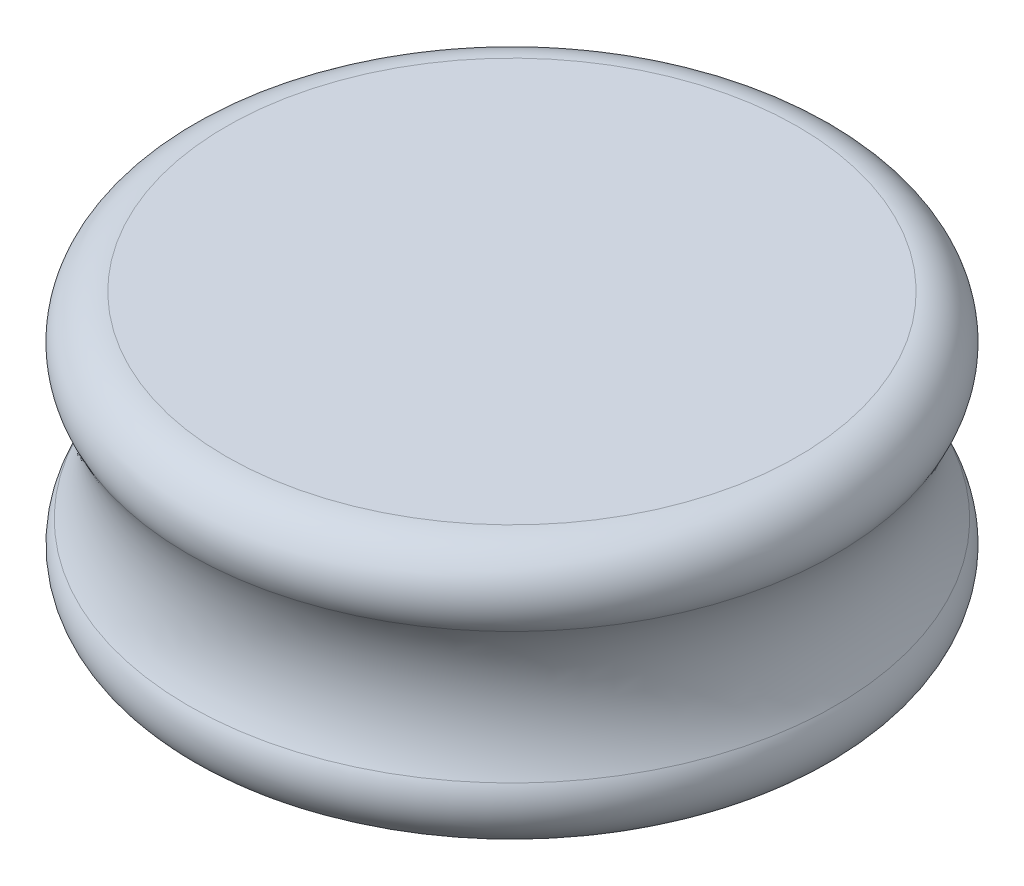
ISO-10303-21;
HEADER;
FILE_DESCRIPTION(('STEP AP214'),'2;1');
FILE_NAME('part.step','',(''),(''),'','','');
FILE_SCHEMA(('AUTOMOTIVE_DESIGN { 1 0 10303 214 1 1 1 1 }'));
ENDSEC;
DATA;
#1=APPLICATION_CONTEXT('core data for automotive mechanical design processes');
#2=APPLICATION_PROTOCOL_DEFINITION('international standard','automotive_design',2000,#1);
#3=PRODUCT_CONTEXT('',#1,'mechanical');
#4=PRODUCT('Part','Part','',(#3));
#5=PRODUCT_RELATED_PRODUCT_CATEGORY('part','',(#4));
#6=PRODUCT_DEFINITION_FORMATION('','',#4);
#7=PRODUCT_DEFINITION_CONTEXT('part definition',#1,'design');
#8=PRODUCT_DEFINITION('design','',#6,#7);
#9=PRODUCT_DEFINITION_SHAPE('','',#8);
#10=(LENGTH_UNIT() NAMED_UNIT(*) SI_UNIT(.MILLI.,.METRE.));
#11=(NAMED_UNIT(*) PLANE_ANGLE_UNIT() SI_UNIT($,.RADIAN.));
#12=(NAMED_UNIT(*) SI_UNIT($,.STERADIAN.) SOLID_ANGLE_UNIT());
#13=UNCERTAINTY_MEASURE_WITH_UNIT(LENGTH_MEASURE(1.E-05),#10,'distance_accuracy_value','');
#14=(GEOMETRIC_REPRESENTATION_CONTEXT(3) GLOBAL_UNCERTAINTY_ASSIGNED_CONTEXT((#13)) GLOBAL_UNIT_ASSIGNED_CONTEXT((#10,
#11,#12)) REPRESENTATION_CONTEXT('',''));
#15=CARTESIAN_POINT('',(0.,0.,0.));
#16=DIRECTION('',(0.,0.,1.));
#17=DIRECTION('',(1.,0.,0.));
#18=AXIS2_PLACEMENT_3D('',#15,#16,#17);
#19=CARTESIAN_POINT('',(0.,0.,0.));
#20=DIRECTION('',(0.,-1.,0.));
#21=DIRECTION('',(0.,0.,-1.));
#22=AXIS2_PLACEMENT_3D('',#19,#20,#21);
#23=PLANE('',#22);
#24=CARTESIAN_POINT('',(0.,0.,0.));
#25=DIRECTION('',(0.,-1.,0.));
#26=DIRECTION('',(0.,0.,-1.));
#27=AXIS2_PLACEMENT_3D('',#24,#25,#26);
#28=CIRCLE('',#27,13.0717967697245);
#29=CARTESIAN_POINT('',(0.,0.,-13.0717967697245));
#30=VERTEX_POINT('',#29);
#31=EDGE_CURVE('E43',#30,#30,#28,.T.);
#32=ORIENTED_EDGE('',*,*,#31,.T.);
#33=EDGE_LOOP('',(#32));
#34=FACE_BOUND('',#33,.T.);
#35=ADVANCED_FACE('F38',(#34),#23,.T.);
#36=CARTESIAN_POINT('',(0.,6.,0.));
#37=DIRECTION('',(0.,-1.,0.));
#38=DIRECTION('',(0.,0.,-1.));
#39=AXIS2_PLACEMENT_3D('',#36,#37,#38);
#40=TOROIDAL_SURFACE('',#39,20.,6.);
#41=CARTESIAN_POINT('',(0.,3.,0.));
#42=DIRECTION('',(0.,1.,0.));
#43=DIRECTION('',(0.,0.,1.));
#44=AXIS2_PLACEMENT_3D('',#41,#42,#43);
#45=CIRCLE('',#44,14.8038475772934);
#46=CARTESIAN_POINT('',(0.,3.,14.8038475772934));
#47=VERTEX_POINT('',#46);
#48=EDGE_CURVE('E10',#47,#47,#45,.T.);
#49=ORIENTED_EDGE('',*,*,#48,.T.);
#50=EDGE_LOOP('',(#49));
#51=FACE_BOUND('',#50,.T.);
#52=CARTESIAN_POINT('',(0.,9.,0.));
#53=DIRECTION('',(0.,-1.,0.));
#54=DIRECTION('',(0.,0.,-1.));
#55=AXIS2_PLACEMENT_3D('',#52,#53,#54);
#56=CIRCLE('',#55,14.8038475772934);
#57=CARTESIAN_POINT('',(0.,9.,-14.8038475772934));
#58=VERTEX_POINT('',#57);
#59=EDGE_CURVE('E51',#58,#58,#56,.T.);
#60=ORIENTED_EDGE('',*,*,#59,.T.);
#61=EDGE_LOOP('',(#60));
#62=FACE_BOUND('',#61,.T.);
#63=ADVANCED_FACE('F60',(#51,#62),#40,.F.);
#64=CARTESIAN_POINT('',(17.,12.,0.));
#65=DIRECTION('',(0.,1.,0.));
#66=DIRECTION('',(0.,0.,1.));
#67=AXIS2_PLACEMENT_3D('',#64,#65,#66);
#68=PLANE('',#67);
#69=CARTESIAN_POINT('',(0.,12.,0.));
#70=DIRECTION('',(0.,1.,0.));
#71=DIRECTION('',(0.,0.,1.));
#72=AXIS2_PLACEMENT_3D('',#69,#70,#71);
#73=CIRCLE('',#72,13.0717967697245);
#74=CARTESIAN_POINT('',(0.,12.,13.0717967697245));
#75=VERTEX_POINT('',#74);
#76=EDGE_CURVE('E50',#75,#75,#73,.T.);
#77=ORIENTED_EDGE('',*,*,#76,.T.);
#78=EDGE_LOOP('',(#77));
#79=FACE_BOUND('',#78,.T.);
#80=ADVANCED_FACE('F61',(#79),#68,.T.);
#81=CARTESIAN_POINT('',(0.,10.,0.));
#82=DIRECTION('',(0.,-1.,0.));
#83=DIRECTION('',(0.,0.,-1.));
#84=AXIS2_PLACEMENT_3D('',#81,#82,#83);
#85=TOROIDAL_SURFACE('',#84,13.0717967697245,2.);
#86=ORIENTED_EDGE('',*,*,#76,.F.);
#87=EDGE_LOOP('',(#86));
#88=FACE_BOUND('',#87,.T.);
#89=ORIENTED_EDGE('',*,*,#59,.F.);
#90=EDGE_LOOP('',(#89));
#91=FACE_BOUND('',#90,.T.);
#92=ADVANCED_FACE('F56',(#88,#91),#85,.T.);
#93=CARTESIAN_POINT('',(0.,2.,0.));
#94=DIRECTION('',(0.,1.,0.));
#95=DIRECTION('',(0.,0.,1.));
#96=AXIS2_PLACEMENT_3D('',#93,#94,#95);
#97=TOROIDAL_SURFACE('',#96,13.0717967697245,2.);
#98=ORIENTED_EDGE('',*,*,#48,.F.);
#99=EDGE_LOOP('',(#98));
#100=FACE_BOUND('',#99,.T.);
#101=ORIENTED_EDGE('',*,*,#31,.F.);
#102=EDGE_LOOP('',(#101));
#103=FACE_BOUND('',#102,.T.);
#104=ADVANCED_FACE('F36',(#100,#103),#97,.T.);
#105=CLOSED_SHELL('',(#35,#63,#80,#92,#104));
#106=MANIFOLD_SOLID_BREP('B2',#105);
#107=ADVANCED_BREP_SHAPE_REPRESENTATION('',(#18,#106),#14);
#108=SHAPE_DEFINITION_REPRESENTATION(#9,#107);
ENDSEC;
END-ISO-10303-21;
